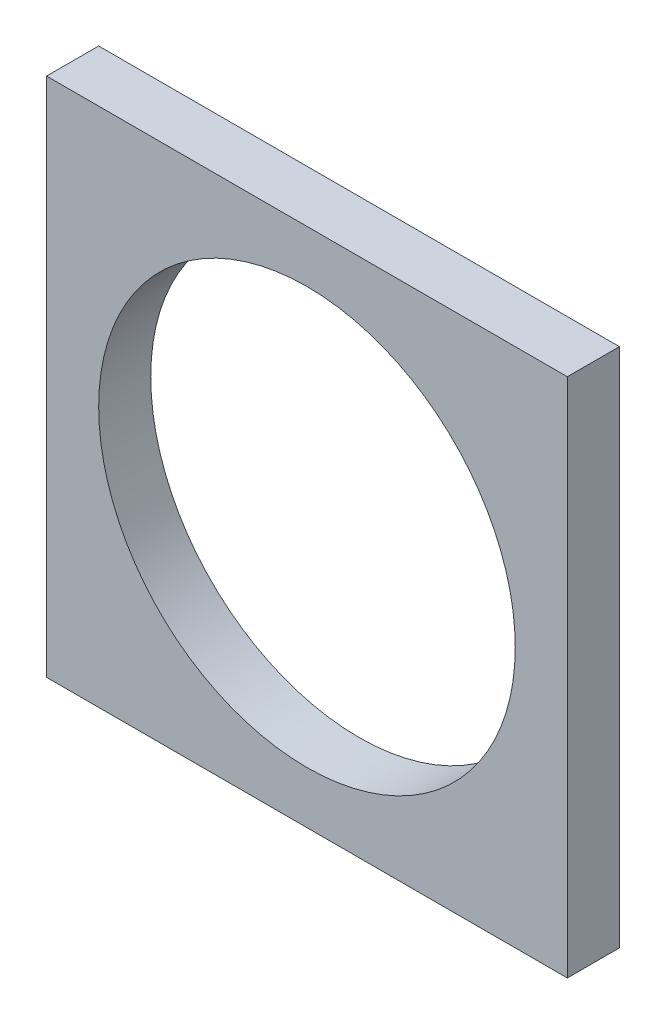
ISO-10303-21;
HEADER;
FILE_DESCRIPTION(('STEP AP214'),'2;1');
FILE_NAME('part.step','',(''),(''),'','','');
FILE_SCHEMA(('AUTOMOTIVE_DESIGN { 1 0 10303 214 1 1 1 1 }'));
ENDSEC;
DATA;
#1=APPLICATION_CONTEXT('core data for automotive mechanical design processes');
#2=APPLICATION_PROTOCOL_DEFINITION('international standard','automotive_design',2000,#1);
#3=PRODUCT_CONTEXT('',#1,'mechanical');
#4=PRODUCT('Part','Part','',(#3));
#5=PRODUCT_RELATED_PRODUCT_CATEGORY('part','',(#4));
#6=PRODUCT_DEFINITION_FORMATION('','',#4);
#7=PRODUCT_DEFINITION_CONTEXT('part definition',#1,'design');
#8=PRODUCT_DEFINITION('design','',#6,#7);
#9=PRODUCT_DEFINITION_SHAPE('','',#8);
#10=(LENGTH_UNIT() NAMED_UNIT(*) SI_UNIT(.MILLI.,.METRE.));
#11=(NAMED_UNIT(*) PLANE_ANGLE_UNIT() SI_UNIT($,.RADIAN.));
#12=(NAMED_UNIT(*) SI_UNIT($,.STERADIAN.) SOLID_ANGLE_UNIT());
#13=UNCERTAINTY_MEASURE_WITH_UNIT(LENGTH_MEASURE(1.E-05),#10,'distance_accuracy_value','');
#14=(GEOMETRIC_REPRESENTATION_CONTEXT(3) GLOBAL_UNCERTAINTY_ASSIGNED_CONTEXT((#13)) GLOBAL_UNIT_ASSIGNED_CONTEXT((#10,
#11,#12)) REPRESENTATION_CONTEXT('',''));
#15=CARTESIAN_POINT('',(0.,0.,0.));
#16=DIRECTION('',(0.,0.,1.));
#17=DIRECTION('',(1.,0.,0.));
#18=AXIS2_PLACEMENT_3D('',#15,#16,#17);
#19=CARTESIAN_POINT('',(0.,0.,10.));
#20=DIRECTION('',(0.,0.,1.));
#21=DIRECTION('',(1.,0.,0.));
#22=AXIS2_PLACEMENT_3D('',#19,#20,#21);
#23=PLANE('',#22);
#24=DIRECTION('',(-1.,0.,0.));
#25=VECTOR('',#24,1.);
#26=CARTESIAN_POINT('',(50.,50.,10.));
#27=LINE('',#26,#25);
#28=CARTESIAN_POINT('',(50.,50.,10.));
#29=VERTEX_POINT('',#28);
#30=CARTESIAN_POINT('',(-50.,50.,10.));
#31=VERTEX_POINT('',#30);
#32=EDGE_CURVE('E93',#29,#31,#27,.T.);
#33=ORIENTED_EDGE('',*,*,#32,.T.);
#34=DIRECTION('',(0.,-1.,0.));
#35=VECTOR('',#34,1.);
#36=CARTESIAN_POINT('',(-50.,50.,10.));
#37=LINE('',#36,#35);
#38=CARTESIAN_POINT('',(-50.,-50.,10.));
#39=VERTEX_POINT('',#38);
#40=EDGE_CURVE('E88',#31,#39,#37,.T.);
#41=ORIENTED_EDGE('',*,*,#40,.T.);
#42=DIRECTION('',(1.,0.,0.));
#43=VECTOR('',#42,1.);
#44=CARTESIAN_POINT('',(-50.,-50.,10.));
#45=LINE('',#44,#43);
#46=CARTESIAN_POINT('',(50.,-50.,10.));
#47=VERTEX_POINT('',#46);
#48=EDGE_CURVE('E91',#39,#47,#45,.T.);
#49=ORIENTED_EDGE('',*,*,#48,.T.);
#50=DIRECTION('',(0.,1.,0.));
#51=VECTOR('',#50,1.);
#52=CARTESIAN_POINT('',(50.,-50.,10.));
#53=LINE('',#52,#51);
#54=EDGE_CURVE('E58',#47,#29,#53,.T.);
#55=ORIENTED_EDGE('',*,*,#54,.T.);
#56=EDGE_LOOP('',(#33,#41,#49,#55));
#57=FACE_BOUND('',#56,.T.);
#58=CARTESIAN_POINT('',(0.,0.,10.));
#59=DIRECTION('',(0.,0.,1.));
#60=DIRECTION('',(1.,0.,0.));
#61=AXIS2_PLACEMENT_3D('',#58,#59,#60);
#62=CIRCLE('',#61,40.);
#63=CARTESIAN_POINT('',(40.,0.,10.));
#64=VERTEX_POINT('',#63);
#65=EDGE_CURVE('E108',#64,#64,#62,.T.);
#66=ORIENTED_EDGE('',*,*,#65,.F.);
#67=EDGE_LOOP('',(#66));
#68=FACE_BOUND('',#67,.T.);
#69=ADVANCED_FACE('F41',(#57,#68),#23,.T.);
#70=CARTESIAN_POINT('',(0.,0.,0.));
#71=DIRECTION('',(0.,0.,1.));
#72=DIRECTION('',(1.,0.,0.));
#73=AXIS2_PLACEMENT_3D('',#70,#71,#72);
#74=PLANE('',#73);
#75=DIRECTION('',(-1.,0.,0.));
#76=VECTOR('',#75,1.);
#77=CARTESIAN_POINT('',(50.,50.,0.));
#78=LINE('',#77,#76);
#79=CARTESIAN_POINT('',(50.,50.,0.));
#80=VERTEX_POINT('',#79);
#81=CARTESIAN_POINT('',(-50.,50.,0.));
#82=VERTEX_POINT('',#81);
#83=EDGE_CURVE('E105',#80,#82,#78,.T.);
#84=ORIENTED_EDGE('',*,*,#83,.F.);
#85=DIRECTION('',(0.,1.,0.));
#86=VECTOR('',#85,1.);
#87=CARTESIAN_POINT('',(50.,-50.,0.));
#88=LINE('',#87,#86);
#89=CARTESIAN_POINT('',(50.,-50.,0.));
#90=VERTEX_POINT('',#89);
#91=EDGE_CURVE('E81',#90,#80,#88,.T.);
#92=ORIENTED_EDGE('',*,*,#91,.F.);
#93=DIRECTION('',(1.,0.,0.));
#94=VECTOR('',#93,1.);
#95=CARTESIAN_POINT('',(-50.,-50.,0.));
#96=LINE('',#95,#94);
#97=CARTESIAN_POINT('',(-50.,-50.,0.));
#98=VERTEX_POINT('',#97);
#99=EDGE_CURVE('E75',#98,#90,#96,.T.);
#100=ORIENTED_EDGE('',*,*,#99,.F.);
#101=DIRECTION('',(0.,-1.,0.));
#102=VECTOR('',#101,1.);
#103=CARTESIAN_POINT('',(-50.,50.,0.));
#104=LINE('',#103,#102);
#105=EDGE_CURVE('E97',#82,#98,#104,.T.);
#106=ORIENTED_EDGE('',*,*,#105,.F.);
#107=EDGE_LOOP('',(#84,#92,#100,#106));
#108=FACE_BOUND('',#107,.T.);
#109=CARTESIAN_POINT('',(0.,0.,0.));
#110=DIRECTION('',(0.,0.,1.));
#111=DIRECTION('',(1.,0.,0.));
#112=AXIS2_PLACEMENT_3D('',#109,#110,#111);
#113=CIRCLE('',#112,40.);
#114=CARTESIAN_POINT('',(40.,0.,0.));
#115=VERTEX_POINT('',#114);
#116=EDGE_CURVE('E120',#115,#115,#113,.T.);
#117=ORIENTED_EDGE('',*,*,#116,.T.);
#118=EDGE_LOOP('',(#117));
#119=FACE_BOUND('',#118,.T.);
#120=ADVANCED_FACE('F116',(#108,#119),#74,.F.);
#121=CARTESIAN_POINT('',(50.,50.,10.));
#122=DIRECTION('',(0.,-1.,0.));
#123=DIRECTION('',(1.,0.,0.));
#124=AXIS2_PLACEMENT_3D('',#121,#122,#123);
#125=PLANE('',#124);
#126=ORIENTED_EDGE('',*,*,#83,.T.);
#127=DIRECTION('',(0.,0.,-1.));
#128=VECTOR('',#127,1.);
#129=CARTESIAN_POINT('',(-50.,50.,10.));
#130=LINE('',#129,#128);
#131=EDGE_CURVE('E11',#31,#82,#130,.T.);
#132=ORIENTED_EDGE('',*,*,#131,.F.);
#133=ORIENTED_EDGE('',*,*,#32,.F.);
#134=DIRECTION('',(0.,0.,-1.));
#135=VECTOR('',#134,1.);
#136=CARTESIAN_POINT('',(50.,50.,10.));
#137=LINE('',#136,#135);
#138=EDGE_CURVE('E101',#29,#80,#137,.T.);
#139=ORIENTED_EDGE('',*,*,#138,.T.);
#140=EDGE_LOOP('',(#126,#132,#133,#139));
#141=FACE_BOUND('',#140,.T.);
#142=ADVANCED_FACE('F43',(#141),#125,.F.);
#143=CARTESIAN_POINT('',(-50.,50.,10.));
#144=DIRECTION('',(1.,0.,0.));
#145=DIRECTION('',(0.,1.,0.));
#146=AXIS2_PLACEMENT_3D('',#143,#144,#145);
#147=PLANE('',#146);
#148=ORIENTED_EDGE('',*,*,#105,.T.);
#149=DIRECTION('',(0.,0.,-1.));
#150=VECTOR('',#149,1.);
#151=CARTESIAN_POINT('',(-50.,-50.,10.));
#152=LINE('',#151,#150);
#153=EDGE_CURVE('E50',#39,#98,#152,.T.);
#154=ORIENTED_EDGE('',*,*,#153,.F.);
#155=ORIENTED_EDGE('',*,*,#40,.F.);
#156=ORIENTED_EDGE('',*,*,#131,.T.);
#157=EDGE_LOOP('',(#148,#154,#155,#156));
#158=FACE_BOUND('',#157,.T.);
#159=ADVANCED_FACE('F96',(#158),#147,.F.);
#160=CARTESIAN_POINT('',(-50.,-50.,10.));
#161=DIRECTION('',(0.,1.,0.));
#162=DIRECTION('',(-1.,0.,0.));
#163=AXIS2_PLACEMENT_3D('',#160,#161,#162);
#164=PLANE('',#163);
#165=ORIENTED_EDGE('',*,*,#99,.T.);
#166=DIRECTION('',(0.,0.,-1.));
#167=VECTOR('',#166,1.);
#168=CARTESIAN_POINT('',(50.,-50.,10.));
#169=LINE('',#168,#167);
#170=EDGE_CURVE('E98',#47,#90,#169,.T.);
#171=ORIENTED_EDGE('',*,*,#170,.F.);
#172=ORIENTED_EDGE('',*,*,#48,.F.);
#173=ORIENTED_EDGE('',*,*,#153,.T.);
#174=EDGE_LOOP('',(#165,#171,#172,#173));
#175=FACE_BOUND('',#174,.T.);
#176=ADVANCED_FACE('F99',(#175),#164,.F.);
#177=CARTESIAN_POINT('',(50.,-50.,10.));
#178=DIRECTION('',(-1.,0.,0.));
#179=DIRECTION('',(0.,-1.,0.));
#180=AXIS2_PLACEMENT_3D('',#177,#178,#179);
#181=PLANE('',#180);
#182=ORIENTED_EDGE('',*,*,#91,.T.);
#183=ORIENTED_EDGE('',*,*,#138,.F.);
#184=ORIENTED_EDGE('',*,*,#54,.F.);
#185=ORIENTED_EDGE('',*,*,#170,.T.);
#186=EDGE_LOOP('',(#182,#183,#184,#185));
#187=FACE_BOUND('',#186,.T.);
#188=ADVANCED_FACE('F113',(#187),#181,.F.);
#189=CARTESIAN_POINT('',(0.,0.,10.));
#190=DIRECTION('',(0.,0.,-1.));
#191=DIRECTION('',(-1.,0.,0.));
#192=AXIS2_PLACEMENT_3D('',#189,#190,#191);
#193=CYLINDRICAL_SURFACE('',#192,40.);
#194=ORIENTED_EDGE('',*,*,#65,.T.);
#195=EDGE_LOOP('',(#194));
#196=FACE_BOUND('',#195,.T.);
#197=ORIENTED_EDGE('',*,*,#116,.F.);
#198=EDGE_LOOP('',(#197));
#199=FACE_BOUND('',#198,.T.);
#200=ADVANCED_FACE('F127',(#196,#199),#193,.F.);
#201=CLOSED_SHELL('',(#69,#120,#142,#159,#176,#188,#200));
#202=MANIFOLD_SOLID_BREP('B2',#201);
#203=ADVANCED_BREP_SHAPE_REPRESENTATION('',(#18,#202),#14);
#204=SHAPE_DEFINITION_REPRESENTATION(#9,#203);
ENDSEC;
END-ISO-10303-21;
